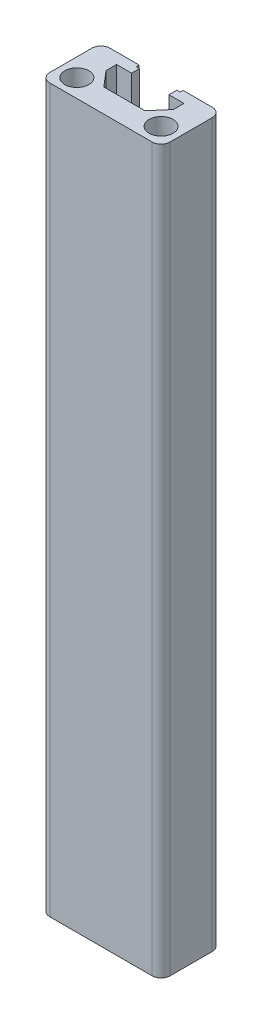
ISO-10303-21;
HEADER;
FILE_DESCRIPTION(('STEP AP214'),'2;1');
FILE_NAME('part.step','',(''),(''),'','','');
FILE_SCHEMA(('AUTOMOTIVE_DESIGN { 1 0 10303 214 1 1 1 1 }'));
ENDSEC;
DATA;
#1=APPLICATION_CONTEXT('core data for automotive mechanical design processes');
#2=APPLICATION_PROTOCOL_DEFINITION('international standard','automotive_design',2000,#1);
#3=PRODUCT_CONTEXT('',#1,'mechanical');
#4=PRODUCT('Part','Part','',(#3));
#5=PRODUCT_RELATED_PRODUCT_CATEGORY('part','',(#4));
#6=PRODUCT_DEFINITION_FORMATION('','',#4);
#7=PRODUCT_DEFINITION_CONTEXT('part definition',#1,'design');
#8=PRODUCT_DEFINITION('design','',#6,#7);
#9=PRODUCT_DEFINITION_SHAPE('','',#8);
#10=(LENGTH_UNIT() NAMED_UNIT(*) SI_UNIT(.MILLI.,.METRE.));
#11=(NAMED_UNIT(*) PLANE_ANGLE_UNIT() SI_UNIT($,.RADIAN.));
#12=(NAMED_UNIT(*) SI_UNIT($,.STERADIAN.) SOLID_ANGLE_UNIT());
#13=UNCERTAINTY_MEASURE_WITH_UNIT(LENGTH_MEASURE(1.E-05),#10,'distance_accuracy_value','');
#14=(GEOMETRIC_REPRESENTATION_CONTEXT(3) GLOBAL_UNCERTAINTY_ASSIGNED_CONTEXT((#13)) GLOBAL_UNIT_ASSIGNED_CONTEXT((#10,
#11,#12)) REPRESENTATION_CONTEXT('',''));
#15=CARTESIAN_POINT('',(0.,0.,0.));
#16=DIRECTION('',(0.,0.,1.));
#17=DIRECTION('',(1.,0.,0.));
#18=AXIS2_PLACEMENT_3D('',#15,#16,#17);
#19=CARTESIAN_POINT('',(0.,120.,0.));
#20=DIRECTION('',(0.,1.,0.));
#21=DIRECTION('',(0.,0.,1.));
#22=AXIS2_PLACEMENT_3D('',#19,#20,#21);
#23=PLANE('',#22);
#24=CARTESIAN_POINT('',(17.,120.,-3.));
#25=DIRECTION('',(0.,1.,0.));
#26=DIRECTION('',(0.,0.,1.));
#27=AXIS2_PLACEMENT_3D('',#24,#25,#26);
#28=CIRCLE('',#27,2.);
#29=CARTESIAN_POINT('',(17.,120.,-0.999999999999997));
#30=VERTEX_POINT('',#29);
#31=EDGE_CURVE('E262',#30,#30,#28,.T.);
#32=ORIENTED_EDGE('',*,*,#31,.F.);
#33=EDGE_LOOP('',(#32));
#34=FACE_BOUND('',#33,.T.);
#35=DIRECTION('',(-1.,0.,0.));
#36=VECTOR('',#35,1.);
#37=CARTESIAN_POINT('',(6.35,120.,-10.));
#38=LINE('',#37,#36);
#39=CARTESIAN_POINT('',(6.35,120.,-10.));
#40=VERTEX_POINT('',#39);
#41=CARTESIAN_POINT('',(1.5,120.,-10.));
#42=VERTEX_POINT('',#41);
#43=EDGE_CURVE('E253',#40,#42,#38,.T.);
#44=ORIENTED_EDGE('',*,*,#43,.T.);
#45=CARTESIAN_POINT('',(1.5,120.,-8.5));
#46=DIRECTION('',(0.,1.,0.));
#47=DIRECTION('',(0.,0.,1.));
#48=AXIS2_PLACEMENT_3D('',#45,#46,#47);
#49=CIRCLE('',#48,1.5);
#50=CARTESIAN_POINT('',(0.,120.,-8.5));
#51=VERTEX_POINT('',#50);
#52=EDGE_CURVE('E393',#42,#51,#49,.T.);
#53=ORIENTED_EDGE('',*,*,#52,.T.);
#54=DIRECTION('',(0.,0.,1.));
#55=VECTOR('',#54,1.);
#56=CARTESIAN_POINT('',(0.,120.,-10.));
#57=LINE('',#56,#55);
#58=CARTESIAN_POINT('',(0.,120.,-1.5));
#59=VERTEX_POINT('',#58);
#60=EDGE_CURVE('E314',#51,#59,#57,.T.);
#61=ORIENTED_EDGE('',*,*,#60,.T.);
#62=CARTESIAN_POINT('',(1.5,120.,-1.5));
#63=DIRECTION('',(0.,1.,0.));
#64=DIRECTION('',(0.,0.,1.));
#65=AXIS2_PLACEMENT_3D('',#62,#63,#64);
#66=CIRCLE('',#65,1.5);
#67=CARTESIAN_POINT('',(1.5,120.,0.));
#68=VERTEX_POINT('',#67);
#69=EDGE_CURVE('E390',#59,#68,#66,.T.);
#70=ORIENTED_EDGE('',*,*,#69,.T.);
#71=DIRECTION('',(1.,0.,0.));
#72=VECTOR('',#71,1.);
#73=CARTESIAN_POINT('',(0.,120.,0.));
#74=LINE('',#73,#72);
#75=CARTESIAN_POINT('',(18.5,120.,0.));
#76=VERTEX_POINT('',#75);
#77=EDGE_CURVE('E522',#68,#76,#74,.T.);
#78=ORIENTED_EDGE('',*,*,#77,.T.);
#79=CARTESIAN_POINT('',(18.5,120.,-1.5));
#80=DIRECTION('',(0.,1.,0.));
#81=DIRECTION('',(0.,0.,1.));
#82=AXIS2_PLACEMENT_3D('',#79,#80,#81);
#83=CIRCLE('',#82,1.5);
#84=CARTESIAN_POINT('',(20.,120.,-1.5));
#85=VERTEX_POINT('',#84);
#86=EDGE_CURVE('E385',#76,#85,#83,.T.);
#87=ORIENTED_EDGE('',*,*,#86,.T.);
#88=DIRECTION('',(0.,0.,-1.));
#89=VECTOR('',#88,1.);
#90=CARTESIAN_POINT('',(20.,120.,0.));
#91=LINE('',#90,#89);
#92=CARTESIAN_POINT('',(20.,120.,-8.5));
#93=VERTEX_POINT('',#92);
#94=EDGE_CURVE('E197',#85,#93,#91,.T.);
#95=ORIENTED_EDGE('',*,*,#94,.T.);
#96=CARTESIAN_POINT('',(18.5,120.,-8.5));
#97=DIRECTION('',(0.,1.,0.));
#98=DIRECTION('',(0.,0.,1.));
#99=AXIS2_PLACEMENT_3D('',#96,#97,#98);
#100=CIRCLE('',#99,1.5);
#101=CARTESIAN_POINT('',(18.5,120.,-10.));
#102=VERTEX_POINT('',#101);
#103=EDGE_CURVE('E55',#93,#102,#100,.T.);
#104=ORIENTED_EDGE('',*,*,#103,.T.);
#105=DIRECTION('',(-1.,0.,0.));
#106=VECTOR('',#105,1.);
#107=CARTESIAN_POINT('',(20.,120.,-10.));
#108=LINE('',#107,#106);
#109=CARTESIAN_POINT('',(13.65,120.,-10.));
#110=VERTEX_POINT('',#109);
#111=EDGE_CURVE('E186',#102,#110,#108,.T.);
#112=ORIENTED_EDGE('',*,*,#111,.T.);
#113=DIRECTION('',(0.,0.,1.));
#114=VECTOR('',#113,1.);
#115=CARTESIAN_POINT('',(13.65,120.,-9.51042760217637));
#116=LINE('',#115,#114);
#117=CARTESIAN_POINT('',(13.65,120.,-9.51042760217637));
#118=VERTEX_POINT('',#117);
#119=EDGE_CURVE('E191',#110,#118,#116,.T.);
#120=ORIENTED_EDGE('',*,*,#119,.T.);
#121=DIRECTION('',(-1.,0.,0.));
#122=VECTOR('',#121,1.);
#123=CARTESIAN_POINT('',(13.1,120.,-9.51042760217637));
#124=LINE('',#123,#122);
#125=CARTESIAN_POINT('',(13.1,120.,-9.51042760217637));
#126=VERTEX_POINT('',#125);
#127=EDGE_CURVE('E214',#118,#126,#124,.T.);
#128=ORIENTED_EDGE('',*,*,#127,.T.);
#129=DIRECTION('',(0.,0.,1.));
#130=VECTOR('',#129,1.);
#131=CARTESIAN_POINT('',(13.1,120.,-8.2));
#132=LINE('',#131,#130);
#133=CARTESIAN_POINT('',(13.1,120.,-8.2));
#134=VERTEX_POINT('',#133);
#135=EDGE_CURVE('E217',#126,#134,#132,.T.);
#136=ORIENTED_EDGE('',*,*,#135,.T.);
#137=DIRECTION('',(1.,0.,0.));
#138=VECTOR('',#137,1.);
#139=CARTESIAN_POINT('',(15.6,120.,-8.2));
#140=LINE('',#139,#138);
#141=CARTESIAN_POINT('',(15.6,120.,-8.2));
#142=VERTEX_POINT('',#141);
#143=EDGE_CURVE('E223',#134,#142,#140,.T.);
#144=ORIENTED_EDGE('',*,*,#143,.T.);
#145=DIRECTION('',(0.,0.,1.));
#146=VECTOR('',#145,1.);
#147=CARTESIAN_POINT('',(15.6,120.,-6.44750713590306));
#148=LINE('',#147,#146);
#149=CARTESIAN_POINT('',(15.6,120.,-6.44750713590306));
#150=VERTEX_POINT('',#149);
#151=EDGE_CURVE('E226',#142,#150,#148,.T.);
#152=ORIENTED_EDGE('',*,*,#151,.T.);
#153=DIRECTION('',(-0.651429062487269,0.,0.758709546893248));
#154=VECTOR('',#153,1.);
#155=CARTESIAN_POINT('',(13.4127068625717,120.,-3.9));
#156=LINE('',#155,#154);
#157=CARTESIAN_POINT('',(13.4127068625717,120.,-3.9));
#158=VERTEX_POINT('',#157);
#159=EDGE_CURVE('E229',#150,#158,#156,.T.);
#160=ORIENTED_EDGE('',*,*,#159,.T.);
#161=DIRECTION('',(-1.,0.,0.));
#162=VECTOR('',#161,1.);
#163=CARTESIAN_POINT('',(6.58729313742833,120.,-3.9));
#164=LINE('',#163,#162);
#165=CARTESIAN_POINT('',(6.58729313742833,120.,-3.9));
#166=VERTEX_POINT('',#165);
#167=EDGE_CURVE('E232',#158,#166,#164,.T.);
#168=ORIENTED_EDGE('',*,*,#167,.T.);
#169=DIRECTION('',(-0.651429062487269,0.,-0.758709546893248));
#170=VECTOR('',#169,1.);
#171=CARTESIAN_POINT('',(4.4,120.,-6.44750713590306));
#172=LINE('',#171,#170);
#173=CARTESIAN_POINT('',(4.4,120.,-6.44750713590306));
#174=VERTEX_POINT('',#173);
#175=EDGE_CURVE('E235',#166,#174,#172,.T.);
#176=ORIENTED_EDGE('',*,*,#175,.T.);
#177=DIRECTION('',(0.,0.,-1.));
#178=VECTOR('',#177,1.);
#179=CARTESIAN_POINT('',(4.4,120.,-8.2));
#180=LINE('',#179,#178);
#181=CARTESIAN_POINT('',(4.4,120.,-8.2));
#182=VERTEX_POINT('',#181);
#183=EDGE_CURVE('E238',#174,#182,#180,.T.);
#184=ORIENTED_EDGE('',*,*,#183,.T.);
#185=DIRECTION('',(1.,0.,0.));
#186=VECTOR('',#185,1.);
#187=CARTESIAN_POINT('',(6.9,120.,-8.2));
#188=LINE('',#187,#186);
#189=CARTESIAN_POINT('',(6.9,120.,-8.2));
#190=VERTEX_POINT('',#189);
#191=EDGE_CURVE('E241',#182,#190,#188,.T.);
#192=ORIENTED_EDGE('',*,*,#191,.T.);
#193=DIRECTION('',(0.,0.,-1.));
#194=VECTOR('',#193,1.);
#195=CARTESIAN_POINT('',(6.9,120.,-9.51042760217637));
#196=LINE('',#195,#194);
#197=CARTESIAN_POINT('',(6.9,120.,-9.51042760217637));
#198=VERTEX_POINT('',#197);
#199=EDGE_CURVE('E244',#190,#198,#196,.T.);
#200=ORIENTED_EDGE('',*,*,#199,.T.);
#201=DIRECTION('',(-1.,0.,0.));
#202=VECTOR('',#201,1.);
#203=CARTESIAN_POINT('',(6.35,120.,-9.51042760217637));
#204=LINE('',#203,#202);
#205=CARTESIAN_POINT('',(6.35,120.,-9.51042760217637));
#206=VERTEX_POINT('',#205);
#207=EDGE_CURVE('E247',#198,#206,#204,.T.);
#208=ORIENTED_EDGE('',*,*,#207,.T.);
#209=DIRECTION('',(0.,0.,-1.));
#210=VECTOR('',#209,1.);
#211=CARTESIAN_POINT('',(6.35,120.,-10.));
#212=LINE('',#211,#210);
#213=EDGE_CURVE('E250',#206,#40,#212,.T.);
#214=ORIENTED_EDGE('',*,*,#213,.T.);
#215=EDGE_LOOP('',(#44,#53,#61,#70,#78,#87,#95,#104,#112,#120,#128,#136,#144,#152,#160,#168,
#176,#184,#192,#200,#208,#214));
#216=FACE_BOUND('',#215,.T.);
#217=CARTESIAN_POINT('',(3.,120.,-3.));
#218=DIRECTION('',(0.,1.,0.));
#219=DIRECTION('',(0.,0.,1.));
#220=AXIS2_PLACEMENT_3D('',#217,#218,#219);
#221=CIRCLE('',#220,2.);
#222=CARTESIAN_POINT('',(3.,120.,-1.));
#223=VERTEX_POINT('',#222);
#224=EDGE_CURVE('E572',#223,#223,#221,.T.);
#225=ORIENTED_EDGE('',*,*,#224,.F.);
#226=EDGE_LOOP('',(#225));
#227=FACE_BOUND('',#226,.T.);
#228=ADVANCED_FACE('F39',(#34,#216,#227),#23,.T.);
#229=CARTESIAN_POINT('',(0.,0.,0.));
#230=DIRECTION('',(0.,1.,0.));
#231=DIRECTION('',(0.,0.,1.));
#232=AXIS2_PLACEMENT_3D('',#229,#230,#231);
#233=PLANE('',#232);
#234=DIRECTION('',(0.,0.,1.));
#235=VECTOR('',#234,1.);
#236=CARTESIAN_POINT('',(0.,0.,-10.));
#237=LINE('',#236,#235);
#238=CARTESIAN_POINT('',(0.,0.,-8.5));
#239=VERTEX_POINT('',#238);
#240=CARTESIAN_POINT('',(0.,0.,-1.5));
#241=VERTEX_POINT('',#240);
#242=EDGE_CURVE('E257',#239,#241,#237,.T.);
#243=ORIENTED_EDGE('',*,*,#242,.F.);
#244=CARTESIAN_POINT('',(1.5,0.,-8.5));
#245=DIRECTION('',(0.,1.,0.));
#246=DIRECTION('',(0.,0.,1.));
#247=AXIS2_PLACEMENT_3D('',#244,#245,#246);
#248=CIRCLE('',#247,1.5);
#249=CARTESIAN_POINT('',(1.5,0.,-10.));
#250=VERTEX_POINT('',#249);
#251=EDGE_CURVE('E379',#239,#250,#248,.F.);
#252=ORIENTED_EDGE('',*,*,#251,.T.);
#253=DIRECTION('',(-1.,0.,0.));
#254=VECTOR('',#253,1.);
#255=CARTESIAN_POINT('',(6.35,0.,-10.));
#256=LINE('',#255,#254);
#257=CARTESIAN_POINT('',(6.35,0.,-10.));
#258=VERTEX_POINT('',#257);
#259=EDGE_CURVE('E310',#258,#250,#256,.T.);
#260=ORIENTED_EDGE('',*,*,#259,.F.);
#261=DIRECTION('',(0.,0.,-1.));
#262=VECTOR('',#261,1.);
#263=CARTESIAN_POINT('',(6.35,0.,-10.));
#264=LINE('',#263,#262);
#265=CARTESIAN_POINT('',(6.35,0.,-9.51042760217637));
#266=VERTEX_POINT('',#265);
#267=EDGE_CURVE('E307',#266,#258,#264,.T.);
#268=ORIENTED_EDGE('',*,*,#267,.F.);
#269=DIRECTION('',(-1.,0.,0.));
#270=VECTOR('',#269,1.);
#271=CARTESIAN_POINT('',(6.35,0.,-9.51042760217637));
#272=LINE('',#271,#270);
#273=CARTESIAN_POINT('',(6.9,0.,-9.51042760217637));
#274=VERTEX_POINT('',#273);
#275=EDGE_CURVE('E304',#274,#266,#272,.T.);
#276=ORIENTED_EDGE('',*,*,#275,.F.);
#277=DIRECTION('',(0.,0.,-1.));
#278=VECTOR('',#277,1.);
#279=CARTESIAN_POINT('',(6.9,0.,-9.51042760217637));
#280=LINE('',#279,#278);
#281=CARTESIAN_POINT('',(6.9,0.,-8.2));
#282=VERTEX_POINT('',#281);
#283=EDGE_CURVE('E301',#282,#274,#280,.T.);
#284=ORIENTED_EDGE('',*,*,#283,.F.);
#285=DIRECTION('',(1.,0.,0.));
#286=VECTOR('',#285,1.);
#287=CARTESIAN_POINT('',(6.9,0.,-8.2));
#288=LINE('',#287,#286);
#289=CARTESIAN_POINT('',(4.4,0.,-8.2));
#290=VERTEX_POINT('',#289);
#291=EDGE_CURVE('E298',#290,#282,#288,.T.);
#292=ORIENTED_EDGE('',*,*,#291,.F.);
#293=DIRECTION('',(0.,0.,-1.));
#294=VECTOR('',#293,1.);
#295=CARTESIAN_POINT('',(4.4,0.,-8.2));
#296=LINE('',#295,#294);
#297=CARTESIAN_POINT('',(4.4,0.,-6.44750713590306));
#298=VERTEX_POINT('',#297);
#299=EDGE_CURVE('E295',#298,#290,#296,.T.);
#300=ORIENTED_EDGE('',*,*,#299,.F.);
#301=DIRECTION('',(-0.651429062487269,0.,-0.758709546893248));
#302=VECTOR('',#301,1.);
#303=CARTESIAN_POINT('',(4.4,0.,-6.44750713590306));
#304=LINE('',#303,#302);
#305=CARTESIAN_POINT('',(6.58729313742833,0.,-3.9));
#306=VERTEX_POINT('',#305);
#307=EDGE_CURVE('E292',#306,#298,#304,.T.);
#308=ORIENTED_EDGE('',*,*,#307,.F.);
#309=DIRECTION('',(-1.,0.,0.));
#310=VECTOR('',#309,1.);
#311=CARTESIAN_POINT('',(6.58729313742833,0.,-3.9));
#312=LINE('',#311,#310);
#313=CARTESIAN_POINT('',(13.4127068625717,0.,-3.9));
#314=VERTEX_POINT('',#313);
#315=EDGE_CURVE('E289',#314,#306,#312,.T.);
#316=ORIENTED_EDGE('',*,*,#315,.F.);
#317=DIRECTION('',(-0.651429062487269,0.,0.758709546893248));
#318=VECTOR('',#317,1.);
#319=CARTESIAN_POINT('',(13.4127068625717,0.,-3.9));
#320=LINE('',#319,#318);
#321=CARTESIAN_POINT('',(15.6,0.,-6.44750713590306));
#322=VERTEX_POINT('',#321);
#323=EDGE_CURVE('E286',#322,#314,#320,.T.);
#324=ORIENTED_EDGE('',*,*,#323,.F.);
#325=DIRECTION('',(0.,0.,1.));
#326=VECTOR('',#325,1.);
#327=CARTESIAN_POINT('',(15.6,0.,-6.44750713590306));
#328=LINE('',#327,#326);
#329=CARTESIAN_POINT('',(15.6,0.,-8.2));
#330=VERTEX_POINT('',#329);
#331=EDGE_CURVE('E283',#330,#322,#328,.T.);
#332=ORIENTED_EDGE('',*,*,#331,.F.);
#333=DIRECTION('',(1.,0.,0.));
#334=VECTOR('',#333,1.);
#335=CARTESIAN_POINT('',(15.6,0.,-8.2));
#336=LINE('',#335,#334);
#337=CARTESIAN_POINT('',(13.1,0.,-8.2));
#338=VERTEX_POINT('',#337);
#339=EDGE_CURVE('E280',#338,#330,#336,.T.);
#340=ORIENTED_EDGE('',*,*,#339,.F.);
#341=DIRECTION('',(0.,0.,1.));
#342=VECTOR('',#341,1.);
#343=CARTESIAN_POINT('',(13.1,0.,-8.2));
#344=LINE('',#343,#342);
#345=CARTESIAN_POINT('',(13.1,0.,-9.51042760217637));
#346=VERTEX_POINT('',#345);
#347=EDGE_CURVE('E277',#346,#338,#344,.T.);
#348=ORIENTED_EDGE('',*,*,#347,.F.);
#349=DIRECTION('',(-1.,0.,0.));
#350=VECTOR('',#349,1.);
#351=CARTESIAN_POINT('',(13.1,0.,-9.51042760217637));
#352=LINE('',#351,#350);
#353=CARTESIAN_POINT('',(13.65,0.,-9.51042760217637));
#354=VERTEX_POINT('',#353);
#355=EDGE_CURVE('E274',#354,#346,#352,.T.);
#356=ORIENTED_EDGE('',*,*,#355,.F.);
#357=DIRECTION('',(0.,0.,1.));
#358=VECTOR('',#357,1.);
#359=CARTESIAN_POINT('',(13.65,0.,-9.51042760217637));
#360=LINE('',#359,#358);
#361=CARTESIAN_POINT('',(13.65,0.,-10.));
#362=VERTEX_POINT('',#361);
#363=EDGE_CURVE('E271',#362,#354,#360,.T.);
#364=ORIENTED_EDGE('',*,*,#363,.F.);
#365=DIRECTION('',(-1.,0.,0.));
#366=VECTOR('',#365,1.);
#367=CARTESIAN_POINT('',(20.,0.,-10.));
#368=LINE('',#367,#366);
#369=CARTESIAN_POINT('',(18.5,0.,-10.));
#370=VERTEX_POINT('',#369);
#371=EDGE_CURVE('E203',#370,#362,#368,.T.);
#372=ORIENTED_EDGE('',*,*,#371,.F.);
#373=CARTESIAN_POINT('',(18.5,0.,-8.5));
#374=DIRECTION('',(0.,1.,0.));
#375=DIRECTION('',(0.,0.,1.));
#376=AXIS2_PLACEMENT_3D('',#373,#374,#375);
#377=CIRCLE('',#376,1.5);
#378=CARTESIAN_POINT('',(20.,0.,-8.5));
#379=VERTEX_POINT('',#378);
#380=EDGE_CURVE('E373',#370,#379,#377,.F.);
#381=ORIENTED_EDGE('',*,*,#380,.T.);
#382=DIRECTION('',(0.,0.,-1.));
#383=VECTOR('',#382,1.);
#384=CARTESIAN_POINT('',(20.,0.,0.));
#385=LINE('',#384,#383);
#386=CARTESIAN_POINT('',(20.,0.,-1.5));
#387=VERTEX_POINT('',#386);
#388=EDGE_CURVE('E266',#387,#379,#385,.T.);
#389=ORIENTED_EDGE('',*,*,#388,.F.);
#390=CARTESIAN_POINT('',(18.5,0.,-1.5));
#391=DIRECTION('',(0.,1.,0.));
#392=DIRECTION('',(0.,0.,1.));
#393=AXIS2_PLACEMENT_3D('',#390,#391,#392);
#394=CIRCLE('',#393,1.5);
#395=CARTESIAN_POINT('',(18.5,0.,0.));
#396=VERTEX_POINT('',#395);
#397=EDGE_CURVE('E370',#387,#396,#394,.F.);
#398=ORIENTED_EDGE('',*,*,#397,.T.);
#399=DIRECTION('',(1.,0.,0.));
#400=VECTOR('',#399,1.);
#401=CARTESIAN_POINT('',(0.,0.,0.));
#402=LINE('',#401,#400);
#403=CARTESIAN_POINT('',(1.5,0.,0.));
#404=VERTEX_POINT('',#403);
#405=EDGE_CURVE('E261',#404,#396,#402,.T.);
#406=ORIENTED_EDGE('',*,*,#405,.F.);
#407=CARTESIAN_POINT('',(1.5,0.,-1.5));
#408=DIRECTION('',(0.,1.,0.));
#409=DIRECTION('',(0.,0.,1.));
#410=AXIS2_PLACEMENT_3D('',#407,#408,#409);
#411=CIRCLE('',#410,1.5);
#412=EDGE_CURVE('E376',#404,#241,#411,.F.);
#413=ORIENTED_EDGE('',*,*,#412,.T.);
#414=EDGE_LOOP('',(#243,#252,#260,#268,#276,#284,#292,#300,#308,#316,#324,#332,#340,#348,#356,
#364,#372,#381,#389,#398,#406,#413));
#415=FACE_BOUND('',#414,.T.);
#416=CARTESIAN_POINT('',(17.,0.,-3.));
#417=DIRECTION('',(0.,1.,0.));
#418=DIRECTION('',(0.,0.,1.));
#419=AXIS2_PLACEMENT_3D('',#416,#417,#418);
#420=CIRCLE('',#419,2.);
#421=CARTESIAN_POINT('',(17.,0.,-0.999999999999997));
#422=VERTEX_POINT('',#421);
#423=EDGE_CURVE('E528',#422,#422,#420,.T.);
#424=ORIENTED_EDGE('',*,*,#423,.T.);
#425=EDGE_LOOP('',(#424));
#426=FACE_BOUND('',#425,.T.);
#427=CARTESIAN_POINT('',(3.,0.,-3.));
#428=DIRECTION('',(0.,1.,0.));
#429=DIRECTION('',(0.,0.,1.));
#430=AXIS2_PLACEMENT_3D('',#427,#428,#429);
#431=CIRCLE('',#430,2.);
#432=CARTESIAN_POINT('',(3.,0.,-1.));
#433=VERTEX_POINT('',#432);
#434=EDGE_CURVE('E576',#433,#433,#431,.T.);
#435=ORIENTED_EDGE('',*,*,#434,.T.);
#436=EDGE_LOOP('',(#435));
#437=FACE_BOUND('',#436,.T.);
#438=ADVANCED_FACE('F414',(#415,#426,#437),#233,.F.);
#439=CARTESIAN_POINT('',(0.,120.,-10.));
#440=DIRECTION('',(1.,0.,0.));
#441=DIRECTION('',(0.,0.,-1.));
#442=AXIS2_PLACEMENT_3D('',#439,#440,#441);
#443=PLANE('',#442);
#444=ORIENTED_EDGE('',*,*,#60,.F.);
#445=DIRECTION('',(0.,-1.,0.));
#446=VECTOR('',#445,1.);
#447=CARTESIAN_POINT('',(0.,120.,-8.5));
#448=LINE('',#447,#446);
#449=EDGE_CURVE('E366',#51,#239,#448,.T.);
#450=ORIENTED_EDGE('',*,*,#449,.T.);
#451=ORIENTED_EDGE('',*,*,#242,.T.);
#452=DIRECTION('',(0.,-1.,0.));
#453=VECTOR('',#452,1.);
#454=CARTESIAN_POINT('',(0.,120.,-1.5));
#455=LINE('',#454,#453);
#456=EDGE_CURVE('E207',#241,#59,#455,.F.);
#457=ORIENTED_EDGE('',*,*,#456,.T.);
#458=EDGE_LOOP('',(#444,#450,#451,#457));
#459=FACE_BOUND('',#458,.T.);
#460=ADVANCED_FACE('F434',(#459),#443,.F.);
#461=CARTESIAN_POINT('',(0.,120.,0.));
#462=DIRECTION('',(0.,0.,-1.));
#463=DIRECTION('',(-1.,0.,0.));
#464=AXIS2_PLACEMENT_3D('',#461,#462,#463);
#465=PLANE('',#464);
#466=ORIENTED_EDGE('',*,*,#77,.F.);
#467=DIRECTION('',(0.,-1.,0.));
#468=VECTOR('',#467,1.);
#469=CARTESIAN_POINT('',(1.5,120.,0.));
#470=LINE('',#469,#468);
#471=EDGE_CURVE('E399',#68,#404,#470,.T.);
#472=ORIENTED_EDGE('',*,*,#471,.T.);
#473=ORIENTED_EDGE('',*,*,#405,.T.);
#474=DIRECTION('',(0.,-1.,0.));
#475=VECTOR('',#474,1.);
#476=CARTESIAN_POINT('',(18.5,120.,0.));
#477=LINE('',#476,#475);
#478=EDGE_CURVE('E396',#396,#76,#477,.F.);
#479=ORIENTED_EDGE('',*,*,#478,.T.);
#480=EDGE_LOOP('',(#466,#472,#473,#479));
#481=FACE_BOUND('',#480,.T.);
#482=ADVANCED_FACE('F499',(#481),#465,.F.);
#483=CARTESIAN_POINT('',(20.,120.,0.));
#484=DIRECTION('',(-1.,0.,0.));
#485=DIRECTION('',(0.,0.,1.));
#486=AXIS2_PLACEMENT_3D('',#483,#484,#485);
#487=PLANE('',#486);
#488=ORIENTED_EDGE('',*,*,#388,.T.);
#489=DIRECTION('',(0.,-1.,0.));
#490=VECTOR('',#489,1.);
#491=CARTESIAN_POINT('',(20.,120.,-8.5));
#492=LINE('',#491,#490);
#493=EDGE_CURVE('E11',#379,#93,#492,.F.);
#494=ORIENTED_EDGE('',*,*,#493,.T.);
#495=ORIENTED_EDGE('',*,*,#94,.F.);
#496=DIRECTION('',(0.,-1.,0.));
#497=VECTOR('',#496,1.);
#498=CARTESIAN_POINT('',(20.,120.,-1.5));
#499=LINE('',#498,#497);
#500=EDGE_CURVE('E48',#85,#387,#499,.T.);
#501=ORIENTED_EDGE('',*,*,#500,.T.);
#502=EDGE_LOOP('',(#488,#494,#495,#501));
#503=FACE_BOUND('',#502,.T.);
#504=ADVANCED_FACE('F409',(#503),#487,.F.);
#505=CARTESIAN_POINT('',(20.,120.,-10.));
#506=DIRECTION('',(0.,0.,1.));
#507=DIRECTION('',(1.,0.,0.));
#508=AXIS2_PLACEMENT_3D('',#505,#506,#507);
#509=PLANE('',#508);
#510=ORIENTED_EDGE('',*,*,#111,.F.);
#511=DIRECTION('',(0.,-1.,0.));
#512=VECTOR('',#511,1.);
#513=CARTESIAN_POINT('',(18.5,120.,-10.));
#514=LINE('',#513,#512);
#515=EDGE_CURVE('E403',#102,#370,#514,.T.);
#516=ORIENTED_EDGE('',*,*,#515,.T.);
#517=ORIENTED_EDGE('',*,*,#371,.T.);
#518=DIRECTION('',(0.,-1.,0.));
#519=VECTOR('',#518,1.);
#520=CARTESIAN_POINT('',(13.65,120.,-10.));
#521=LINE('',#520,#519);
#522=EDGE_CURVE('E200',#110,#362,#521,.T.);
#523=ORIENTED_EDGE('',*,*,#522,.F.);
#524=EDGE_LOOP('',(#510,#516,#517,#523));
#525=FACE_BOUND('',#524,.T.);
#526=ADVANCED_FACE('F201',(#525),#509,.F.);
#527=CARTESIAN_POINT('',(13.65,120.,-9.51042760217637));
#528=DIRECTION('',(1.,0.,0.));
#529=DIRECTION('',(0.,0.,-1.));
#530=AXIS2_PLACEMENT_3D('',#527,#528,#529);
#531=PLANE('',#530);
#532=ORIENTED_EDGE('',*,*,#363,.T.);
#533=DIRECTION('',(0.,-1.,0.));
#534=VECTOR('',#533,1.);
#535=CARTESIAN_POINT('',(13.65,120.,-9.51042760217637));
#536=LINE('',#535,#534);
#537=EDGE_CURVE('E208',#118,#354,#536,.T.);
#538=ORIENTED_EDGE('',*,*,#537,.F.);
#539=ORIENTED_EDGE('',*,*,#119,.F.);
#540=ORIENTED_EDGE('',*,*,#522,.T.);
#541=EDGE_LOOP('',(#532,#538,#539,#540));
#542=FACE_BOUND('',#541,.T.);
#543=ADVANCED_FACE('F210',(#542),#531,.F.);
#544=CARTESIAN_POINT('',(13.1,120.,-9.51042760217637));
#545=DIRECTION('',(0.,0.,1.));
#546=DIRECTION('',(1.,0.,0.));
#547=AXIS2_PLACEMENT_3D('',#544,#545,#546);
#548=PLANE('',#547);
#549=ORIENTED_EDGE('',*,*,#355,.T.);
#550=DIRECTION('',(0.,-1.,0.));
#551=VECTOR('',#550,1.);
#552=CARTESIAN_POINT('',(13.1,120.,-9.51042760217637));
#553=LINE('',#552,#551);
#554=EDGE_CURVE('E358',#126,#346,#553,.T.);
#555=ORIENTED_EDGE('',*,*,#554,.F.);
#556=ORIENTED_EDGE('',*,*,#127,.F.);
#557=ORIENTED_EDGE('',*,*,#537,.T.);
#558=EDGE_LOOP('',(#549,#555,#556,#557));
#559=FACE_BOUND('',#558,.T.);
#560=ADVANCED_FACE('F488',(#559),#548,.F.);
#561=CARTESIAN_POINT('',(13.1,120.,-8.2));
#562=DIRECTION('',(1.,0.,0.));
#563=DIRECTION('',(0.,0.,-1.));
#564=AXIS2_PLACEMENT_3D('',#561,#562,#563);
#565=PLANE('',#564);
#566=ORIENTED_EDGE('',*,*,#347,.T.);
#567=DIRECTION('',(0.,-1.,0.));
#568=VECTOR('',#567,1.);
#569=CARTESIAN_POINT('',(13.1,120.,-8.2));
#570=LINE('',#569,#568);
#571=EDGE_CURVE('E354',#134,#338,#570,.T.);
#572=ORIENTED_EDGE('',*,*,#571,.F.);
#573=ORIENTED_EDGE('',*,*,#135,.F.);
#574=ORIENTED_EDGE('',*,*,#554,.T.);
#575=EDGE_LOOP('',(#566,#572,#573,#574));
#576=FACE_BOUND('',#575,.T.);
#577=ADVANCED_FACE('F484',(#576),#565,.F.);
#578=CARTESIAN_POINT('',(15.6,120.,-8.2));
#579=DIRECTION('',(0.,0.,-1.));
#580=DIRECTION('',(-1.,0.,0.));
#581=AXIS2_PLACEMENT_3D('',#578,#579,#580);
#582=PLANE('',#581);
#583=ORIENTED_EDGE('',*,*,#339,.T.);
#584=DIRECTION('',(0.,-1.,0.));
#585=VECTOR('',#584,1.);
#586=CARTESIAN_POINT('',(15.6,120.,-8.2));
#587=LINE('',#586,#585);
#588=EDGE_CURVE('E350',#142,#330,#587,.T.);
#589=ORIENTED_EDGE('',*,*,#588,.F.);
#590=ORIENTED_EDGE('',*,*,#143,.F.);
#591=ORIENTED_EDGE('',*,*,#571,.T.);
#592=EDGE_LOOP('',(#583,#589,#590,#591));
#593=FACE_BOUND('',#592,.T.);
#594=ADVANCED_FACE('F480',(#593),#582,.F.);
#595=CARTESIAN_POINT('',(15.6,120.,-6.44750713590306));
#596=DIRECTION('',(1.,0.,0.));
#597=DIRECTION('',(0.,0.,-1.));
#598=AXIS2_PLACEMENT_3D('',#595,#596,#597);
#599=PLANE('',#598);
#600=ORIENTED_EDGE('',*,*,#331,.T.);
#601=DIRECTION('',(0.,-1.,0.));
#602=VECTOR('',#601,1.);
#603=CARTESIAN_POINT('',(15.6,120.,-6.44750713590306));
#604=LINE('',#603,#602);
#605=EDGE_CURVE('E346',#150,#322,#604,.T.);
#606=ORIENTED_EDGE('',*,*,#605,.F.);
#607=ORIENTED_EDGE('',*,*,#151,.F.);
#608=ORIENTED_EDGE('',*,*,#588,.T.);
#609=EDGE_LOOP('',(#600,#606,#607,#608));
#610=FACE_BOUND('',#609,.T.);
#611=ADVANCED_FACE('F476',(#610),#599,.F.);
#612=CARTESIAN_POINT('',(13.4127068625717,120.,-3.9));
#613=DIRECTION('',(0.758709546893248,0.,0.651429062487269));
#614=DIRECTION('',(0.651429062487269,0.,-0.758709546893248));
#615=AXIS2_PLACEMENT_3D('',#612,#613,#614);
#616=PLANE('',#615);
#617=ORIENTED_EDGE('',*,*,#323,.T.);
#618=DIRECTION('',(0.,-1.,0.));
#619=VECTOR('',#618,1.);
#620=CARTESIAN_POINT('',(13.4127068625717,120.,-3.9));
#621=LINE('',#620,#619);
#622=EDGE_CURVE('E342',#158,#314,#621,.T.);
#623=ORIENTED_EDGE('',*,*,#622,.F.);
#624=ORIENTED_EDGE('',*,*,#159,.F.);
#625=ORIENTED_EDGE('',*,*,#605,.T.);
#626=EDGE_LOOP('',(#617,#623,#624,#625));
#627=FACE_BOUND('',#626,.T.);
#628=ADVANCED_FACE('F472',(#627),#616,.F.);
#629=CARTESIAN_POINT('',(6.58729313742833,120.,-3.9));
#630=DIRECTION('',(0.,0.,1.));
#631=DIRECTION('',(1.,0.,0.));
#632=AXIS2_PLACEMENT_3D('',#629,#630,#631);
#633=PLANE('',#632);
#634=ORIENTED_EDGE('',*,*,#315,.T.);
#635=DIRECTION('',(0.,-1.,0.));
#636=VECTOR('',#635,1.);
#637=CARTESIAN_POINT('',(6.58729313742833,120.,-3.9));
#638=LINE('',#637,#636);
#639=EDGE_CURVE('E338',#166,#306,#638,.T.);
#640=ORIENTED_EDGE('',*,*,#639,.F.);
#641=ORIENTED_EDGE('',*,*,#167,.F.);
#642=ORIENTED_EDGE('',*,*,#622,.T.);
#643=EDGE_LOOP('',(#634,#640,#641,#642));
#644=FACE_BOUND('',#643,.T.);
#645=ADVANCED_FACE('F468',(#644),#633,.F.);
#646=CARTESIAN_POINT('',(4.4,120.,-6.44750713590306));
#647=DIRECTION('',(-0.758709546893248,0.,0.651429062487269));
#648=DIRECTION('',(0.651429062487269,0.,0.758709546893248));
#649=AXIS2_PLACEMENT_3D('',#646,#647,#648);
#650=PLANE('',#649);
#651=ORIENTED_EDGE('',*,*,#307,.T.);
#652=DIRECTION('',(0.,-1.,0.));
#653=VECTOR('',#652,1.);
#654=CARTESIAN_POINT('',(4.4,120.,-6.44750713590306));
#655=LINE('',#654,#653);
#656=EDGE_CURVE('E334',#174,#298,#655,.T.);
#657=ORIENTED_EDGE('',*,*,#656,.F.);
#658=ORIENTED_EDGE('',*,*,#175,.F.);
#659=ORIENTED_EDGE('',*,*,#639,.T.);
#660=EDGE_LOOP('',(#651,#657,#658,#659));
#661=FACE_BOUND('',#660,.T.);
#662=ADVANCED_FACE('F464',(#661),#650,.F.);
#663=CARTESIAN_POINT('',(4.4,120.,-8.2));
#664=DIRECTION('',(-1.,0.,0.));
#665=DIRECTION('',(0.,0.,1.));
#666=AXIS2_PLACEMENT_3D('',#663,#664,#665);
#667=PLANE('',#666);
#668=ORIENTED_EDGE('',*,*,#299,.T.);
#669=DIRECTION('',(0.,-1.,0.));
#670=VECTOR('',#669,1.);
#671=CARTESIAN_POINT('',(4.4,120.,-8.2));
#672=LINE('',#671,#670);
#673=EDGE_CURVE('E330',#182,#290,#672,.T.);
#674=ORIENTED_EDGE('',*,*,#673,.F.);
#675=ORIENTED_EDGE('',*,*,#183,.F.);
#676=ORIENTED_EDGE('',*,*,#656,.T.);
#677=EDGE_LOOP('',(#668,#674,#675,#676));
#678=FACE_BOUND('',#677,.T.);
#679=ADVANCED_FACE('F460',(#678),#667,.F.);
#680=CARTESIAN_POINT('',(6.9,120.,-8.2));
#681=DIRECTION('',(0.,0.,-1.));
#682=DIRECTION('',(-1.,0.,0.));
#683=AXIS2_PLACEMENT_3D('',#680,#681,#682);
#684=PLANE('',#683);
#685=ORIENTED_EDGE('',*,*,#291,.T.);
#686=DIRECTION('',(0.,-1.,0.));
#687=VECTOR('',#686,1.);
#688=CARTESIAN_POINT('',(6.9,120.,-8.2));
#689=LINE('',#688,#687);
#690=EDGE_CURVE('E326',#190,#282,#689,.T.);
#691=ORIENTED_EDGE('',*,*,#690,.F.);
#692=ORIENTED_EDGE('',*,*,#191,.F.);
#693=ORIENTED_EDGE('',*,*,#673,.T.);
#694=EDGE_LOOP('',(#685,#691,#692,#693));
#695=FACE_BOUND('',#694,.T.);
#696=ADVANCED_FACE('F456',(#695),#684,.F.);
#697=CARTESIAN_POINT('',(6.9,120.,-9.51042760217637));
#698=DIRECTION('',(-1.,0.,0.));
#699=DIRECTION('',(0.,0.,1.));
#700=AXIS2_PLACEMENT_3D('',#697,#698,#699);
#701=PLANE('',#700);
#702=ORIENTED_EDGE('',*,*,#283,.T.);
#703=DIRECTION('',(0.,-1.,0.));
#704=VECTOR('',#703,1.);
#705=CARTESIAN_POINT('',(6.9,120.,-9.51042760217637));
#706=LINE('',#705,#704);
#707=EDGE_CURVE('E322',#198,#274,#706,.T.);
#708=ORIENTED_EDGE('',*,*,#707,.F.);
#709=ORIENTED_EDGE('',*,*,#199,.F.);
#710=ORIENTED_EDGE('',*,*,#690,.T.);
#711=EDGE_LOOP('',(#702,#708,#709,#710));
#712=FACE_BOUND('',#711,.T.);
#713=ADVANCED_FACE('F452',(#712),#701,.F.);
#714=CARTESIAN_POINT('',(6.35,120.,-9.51042760217637));
#715=DIRECTION('',(0.,0.,1.));
#716=DIRECTION('',(1.,0.,0.));
#717=AXIS2_PLACEMENT_3D('',#714,#715,#716);
#718=PLANE('',#717);
#719=ORIENTED_EDGE('',*,*,#275,.T.);
#720=DIRECTION('',(0.,-1.,0.));
#721=VECTOR('',#720,1.);
#722=CARTESIAN_POINT('',(6.35,120.,-9.51042760217637));
#723=LINE('',#722,#721);
#724=EDGE_CURVE('E318',#206,#266,#723,.T.);
#725=ORIENTED_EDGE('',*,*,#724,.F.);
#726=ORIENTED_EDGE('',*,*,#207,.F.);
#727=ORIENTED_EDGE('',*,*,#707,.T.);
#728=EDGE_LOOP('',(#719,#725,#726,#727));
#729=FACE_BOUND('',#728,.T.);
#730=ADVANCED_FACE('F448',(#729),#718,.F.);
#731=CARTESIAN_POINT('',(6.35,120.,-10.));
#732=DIRECTION('',(-1.,0.,0.));
#733=DIRECTION('',(0.,0.,1.));
#734=AXIS2_PLACEMENT_3D('',#731,#732,#733);
#735=PLANE('',#734);
#736=ORIENTED_EDGE('',*,*,#267,.T.);
#737=DIRECTION('',(0.,-1.,0.));
#738=VECTOR('',#737,1.);
#739=CARTESIAN_POINT('',(6.35,120.,-10.));
#740=LINE('',#739,#738);
#741=EDGE_CURVE('E256',#40,#258,#740,.T.);
#742=ORIENTED_EDGE('',*,*,#741,.F.);
#743=ORIENTED_EDGE('',*,*,#213,.F.);
#744=ORIENTED_EDGE('',*,*,#724,.T.);
#745=EDGE_LOOP('',(#736,#742,#743,#744));
#746=FACE_BOUND('',#745,.T.);
#747=ADVANCED_FACE('F444',(#746),#735,.F.);
#748=CARTESIAN_POINT('',(6.35,120.,-10.));
#749=DIRECTION('',(0.,0.,1.));
#750=DIRECTION('',(1.,0.,0.));
#751=AXIS2_PLACEMENT_3D('',#748,#749,#750);
#752=PLANE('',#751);
#753=ORIENTED_EDGE('',*,*,#259,.T.);
#754=DIRECTION('',(0.,-1.,0.));
#755=VECTOR('',#754,1.);
#756=CARTESIAN_POINT('',(1.5,120.,-10.));
#757=LINE('',#756,#755);
#758=EDGE_CURVE('E382',#250,#42,#757,.F.);
#759=ORIENTED_EDGE('',*,*,#758,.T.);
#760=ORIENTED_EDGE('',*,*,#43,.F.);
#761=ORIENTED_EDGE('',*,*,#741,.T.);
#762=EDGE_LOOP('',(#753,#759,#760,#761));
#763=FACE_BOUND('',#762,.T.);
#764=ADVANCED_FACE('F441',(#763),#752,.F.);
#765=CARTESIAN_POINT('',(17.,120.,-3.));
#766=DIRECTION('',(0.,-1.,0.));
#767=DIRECTION('',(0.,0.,-1.));
#768=AXIS2_PLACEMENT_3D('',#765,#766,#767);
#769=CYLINDRICAL_SURFACE('',#768,2.);
#770=ORIENTED_EDGE('',*,*,#31,.T.);
#771=EDGE_LOOP('',(#770));
#772=FACE_BOUND('',#771,.T.);
#773=ORIENTED_EDGE('',*,*,#423,.F.);
#774=EDGE_LOOP('',(#773));
#775=FACE_BOUND('',#774,.T.);
#776=ADVANCED_FACE('F438',(#772,#775),#769,.F.);
#777=CARTESIAN_POINT('',(3.,120.,-3.));
#778=DIRECTION('',(0.,-1.,0.));
#779=DIRECTION('',(0.,0.,-1.));
#780=AXIS2_PLACEMENT_3D('',#777,#778,#779);
#781=CYLINDRICAL_SURFACE('',#780,2.);
#782=ORIENTED_EDGE('',*,*,#224,.T.);
#783=EDGE_LOOP('',(#782));
#784=FACE_BOUND('',#783,.T.);
#785=ORIENTED_EDGE('',*,*,#434,.F.);
#786=EDGE_LOOP('',(#785));
#787=FACE_BOUND('',#786,.T.);
#788=ADVANCED_FACE('F507',(#784,#787),#781,.F.);
#789=CARTESIAN_POINT('',(1.5,120.,-8.5));
#790=DIRECTION('',(0.,-1.,0.));
#791=DIRECTION('',(0.,0.,-1.));
#792=AXIS2_PLACEMENT_3D('',#789,#790,#791);
#793=CYLINDRICAL_SURFACE('',#792,1.5);
#794=ORIENTED_EDGE('',*,*,#52,.F.);
#795=ORIENTED_EDGE('',*,*,#758,.F.);
#796=ORIENTED_EDGE('',*,*,#251,.F.);
#797=ORIENTED_EDGE('',*,*,#449,.F.);
#798=EDGE_LOOP('',(#794,#795,#796,#797));
#799=FACE_BOUND('',#798,.T.);
#800=ADVANCED_FACE('F425',(#799),#793,.T.);
#801=CARTESIAN_POINT('',(1.5,120.,-1.5));
#802=DIRECTION('',(0.,-1.,0.));
#803=DIRECTION('',(0.,0.,-1.));
#804=AXIS2_PLACEMENT_3D('',#801,#802,#803);
#805=CYLINDRICAL_SURFACE('',#804,1.5);
#806=ORIENTED_EDGE('',*,*,#69,.F.);
#807=ORIENTED_EDGE('',*,*,#456,.F.);
#808=ORIENTED_EDGE('',*,*,#412,.F.);
#809=ORIENTED_EDGE('',*,*,#471,.F.);
#810=EDGE_LOOP('',(#806,#807,#808,#809));
#811=FACE_BOUND('',#810,.T.);
#812=ADVANCED_FACE('F420',(#811),#805,.T.);
#813=CARTESIAN_POINT('',(18.5,120.,-8.5));
#814=DIRECTION('',(0.,-1.,0.));
#815=DIRECTION('',(0.,0.,-1.));
#816=AXIS2_PLACEMENT_3D('',#813,#814,#815);
#817=CYLINDRICAL_SURFACE('',#816,1.5);
#818=ORIENTED_EDGE('',*,*,#103,.F.);
#819=ORIENTED_EDGE('',*,*,#493,.F.);
#820=ORIENTED_EDGE('',*,*,#380,.F.);
#821=ORIENTED_EDGE('',*,*,#515,.F.);
#822=EDGE_LOOP('',(#818,#819,#820,#821));
#823=FACE_BOUND('',#822,.T.);
#824=ADVANCED_FACE('F418',(#823),#817,.T.);
#825=CARTESIAN_POINT('',(18.5,120.,-1.5));
#826=DIRECTION('',(0.,-1.,0.));
#827=DIRECTION('',(0.,0.,-1.));
#828=AXIS2_PLACEMENT_3D('',#825,#826,#827);
#829=CYLINDRICAL_SURFACE('',#828,1.5);
#830=ORIENTED_EDGE('',*,*,#86,.F.);
#831=ORIENTED_EDGE('',*,*,#478,.F.);
#832=ORIENTED_EDGE('',*,*,#397,.F.);
#833=ORIENTED_EDGE('',*,*,#500,.F.);
#834=EDGE_LOOP('',(#830,#831,#832,#833));
#835=FACE_BOUND('',#834,.T.);
#836=ADVANCED_FACE('F41',(#835),#829,.T.);
#837=CLOSED_SHELL('',(#228,#438,#460,#482,#504,#526,#543,#560,#577,#594,#611,#628,#645,#662,
#679,#696,#713,#730,#747,#764,#776,#788,#800,#812,#824,#836));
#838=MANIFOLD_SOLID_BREP('B2',#837);
#839=ADVANCED_BREP_SHAPE_REPRESENTATION('',(#18,#838),#14);
#840=SHAPE_DEFINITION_REPRESENTATION(#9,#839);
ENDSEC;
END-ISO-10303-21;
